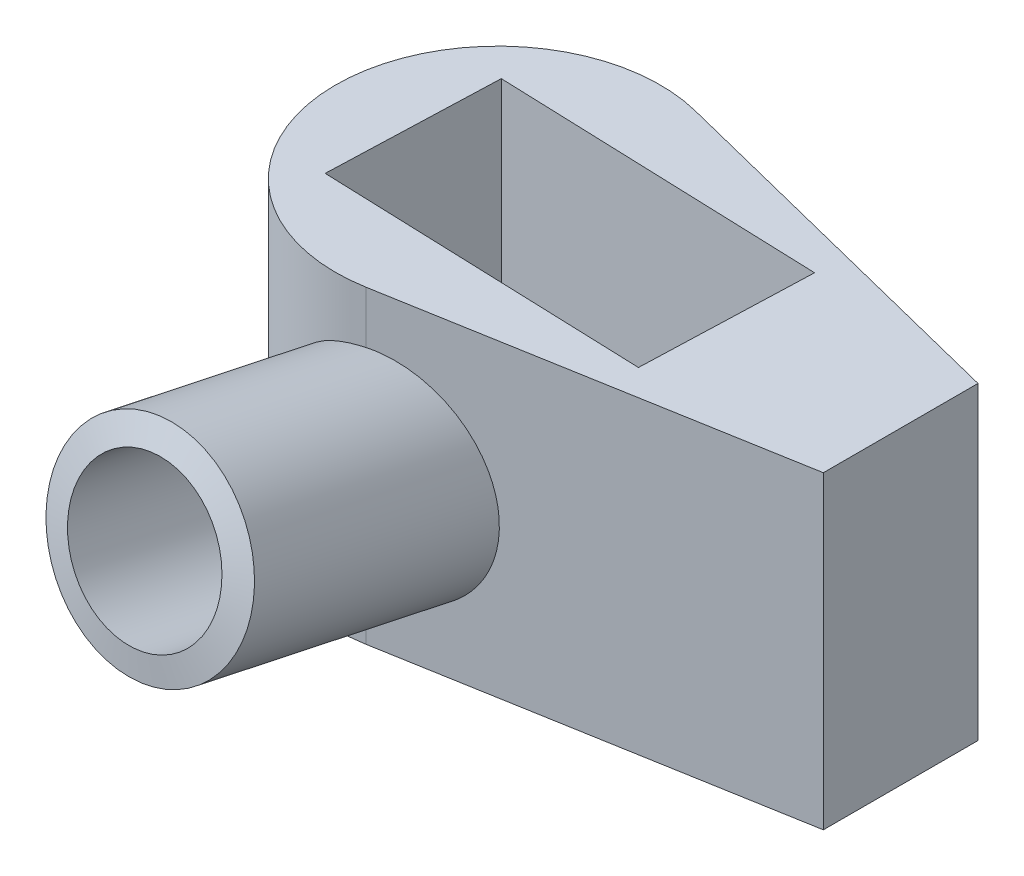
ISO-10303-21;
HEADER;
FILE_DESCRIPTION(('STEP AP214'),'2;1');
FILE_NAME('part.step','',(''),(''),'','','');
FILE_SCHEMA(('AUTOMOTIVE_DESIGN { 1 0 10303 214 1 1 1 1 }'));
ENDSEC;
DATA;
#1=APPLICATION_CONTEXT('core data for automotive mechanical design processes');
#2=APPLICATION_PROTOCOL_DEFINITION('international standard','automotive_design',2000,#1);
#3=PRODUCT_CONTEXT('',#1,'mechanical');
#4=PRODUCT('Part','Part','',(#3));
#5=PRODUCT_RELATED_PRODUCT_CATEGORY('part','',(#4));
#6=PRODUCT_DEFINITION_FORMATION('','',#4);
#7=PRODUCT_DEFINITION_CONTEXT('part definition',#1,'design');
#8=PRODUCT_DEFINITION('design','',#6,#7);
#9=PRODUCT_DEFINITION_SHAPE('','',#8);
#10=(LENGTH_UNIT() NAMED_UNIT(*) SI_UNIT(.MILLI.,.METRE.));
#11=(NAMED_UNIT(*) PLANE_ANGLE_UNIT() SI_UNIT($,.RADIAN.));
#12=(NAMED_UNIT(*) SI_UNIT($,.STERADIAN.) SOLID_ANGLE_UNIT());
#13=UNCERTAINTY_MEASURE_WITH_UNIT(LENGTH_MEASURE(1.E-05),#10,'distance_accuracy_value','');
#14=(GEOMETRIC_REPRESENTATION_CONTEXT(3) GLOBAL_UNCERTAINTY_ASSIGNED_CONTEXT((#13)) GLOBAL_UNIT_ASSIGNED_CONTEXT((#10,
#11,#12)) REPRESENTATION_CONTEXT('',''));
#15=CARTESIAN_POINT('',(0.,0.,0.));
#16=DIRECTION('',(0.,0.,1.));
#17=DIRECTION('',(1.,0.,0.));
#18=AXIS2_PLACEMENT_3D('',#15,#16,#17);
#19=CARTESIAN_POINT('',(53.9751275761126,40.,11.889028669203));
#20=DIRECTION('',(-0.172085400555684,0.,-0.985082034612138));
#21=DIRECTION('',(-0.985082034612138,0.,0.172085400555684));
#22=AXIS2_PLACEMENT_3D('',#19,#20,#21);
#23=PLANE('',#22);
#24=DIRECTION('',(0.,-1.,0.));
#25=VECTOR('',#24,1.);
#26=CARTESIAN_POINT('',(3.61379341166937,40.,20.6867227268549));
#27=LINE('',#26,#25);
#28=CARTESIAN_POINT('',(3.61379341166937,40.,20.6867227268549));
#29=VERTEX_POINT('',#28);
#30=CARTESIAN_POINT('',(3.61379341166937,33.2416263333403,20.6867227268549));
#31=VERTEX_POINT('',#30);
#32=EDGE_CURVE('E120',#29,#31,#27,.T.);
#33=ORIENTED_EDGE('',*,*,#32,.T.);
#34=CARTESIAN_POINT('',(5.1,19.7721701382296,20.4270951556729));
#35=DIRECTION('',(-0.172085400555684,0.,-0.985082034612138));
#36=DIRECTION('',(0.619477545336305,-0.777519491510713,-0.108217425329885));
#37=AXIS2_PLACEMENT_3D('',#34,#35,#36);
#38=ELLIPSE('',#37,13.7044423973439,13.2044300412957);
#39=CARTESIAN_POINT('',(3.61379341166937,6.41319376064316,20.6867227268549));
#40=VERTEX_POINT('',#39);
#41=EDGE_CURVE('E11',#31,#40,#38,.T.);
#42=ORIENTED_EDGE('',*,*,#41,.T.);
#43=CARTESIAN_POINT('',(3.61379341166937,0.,20.6867227268549));
#44=VERTEX_POINT('',#43);
#45=EDGE_CURVE('E121',#40,#44,#27,.T.);
#46=ORIENTED_EDGE('',*,*,#45,.T.);
#47=DIRECTION('',(0.985082034612138,0.,-0.172085400555684));
#48=VECTOR('',#47,1.);
#49=CARTESIAN_POINT('',(53.9751275761126,0.,11.889028669203));
#50=LINE('',#49,#48);
#51=CARTESIAN_POINT('',(53.9751275761126,0.,11.889028669203));
#52=VERTEX_POINT('',#51);
#53=EDGE_CURVE('E205',#44,#52,#50,.T.);
#54=ORIENTED_EDGE('',*,*,#53,.T.);
#55=DIRECTION('',(0.,-1.,0.));
#56=VECTOR('',#55,1.);
#57=CARTESIAN_POINT('',(53.9751275761126,40.,11.889028669203));
#58=LINE('',#57,#56);
#59=CARTESIAN_POINT('',(53.9751275761126,40.,11.889028669203));
#60=VERTEX_POINT('',#59);
#61=EDGE_CURVE('E126',#60,#52,#58,.T.);
#62=ORIENTED_EDGE('',*,*,#61,.F.);
#63=DIRECTION('',(0.985082034612138,0.,-0.172085400555684));
#64=VECTOR('',#63,1.);
#65=CARTESIAN_POINT('',(53.9751275761126,40.,11.889028669203));
#66=LINE('',#65,#64);
#67=EDGE_CURVE('E197',#29,#60,#66,.T.);
#68=ORIENTED_EDGE('',*,*,#67,.F.);
#69=EDGE_LOOP('',(#33,#42,#46,#54,#62,#68));
#70=FACE_BOUND('',#69,.T.);
#71=ADVANCED_FACE('F36',(#70),#23,.F.);
#72=CARTESIAN_POINT('',(0.,40.,0.));
#73=DIRECTION('',(0.,-1.,0.));
#74=DIRECTION('',(0.,0.,-1.));
#75=AXIS2_PLACEMENT_3D('',#72,#73,#74);
#76=CYLINDRICAL_SURFACE('',#75,6.);
#77=CARTESIAN_POINT('',(0.,6.,0.));
#78=DIRECTION('',(0.,-1.,0.));
#79=DIRECTION('',(0.,0.,-1.));
#80=AXIS2_PLACEMENT_3D('',#77,#78,#79);
#81=CIRCLE('',#80,6.);
#82=CARTESIAN_POINT('',(0.,6.,-6.));
#83=VERTEX_POINT('',#82);
#84=EDGE_CURVE('E178',#83,#83,#81,.T.);
#85=ORIENTED_EDGE('',*,*,#84,.T.);
#86=EDGE_LOOP('',(#85));
#87=FACE_BOUND('',#86,.T.);
#88=CARTESIAN_POINT('',(0.,9.5,0.));
#89=DIRECTION('',(0.,1.,0.));
#90=DIRECTION('',(0.,0.,1.));
#91=AXIS2_PLACEMENT_3D('',#88,#89,#90);
#92=CIRCLE('',#91,6.);
#93=CARTESIAN_POINT('',(0.,9.5,6.));
#94=VERTEX_POINT('',#93);
#95=EDGE_CURVE('E134',#94,#94,#92,.F.);
#96=ORIENTED_EDGE('',*,*,#95,.F.);
#97=EDGE_LOOP('',(#96));
#98=FACE_BOUND('',#97,.T.);
#99=ADVANCED_FACE('F251',(#87,#98),#76,.F.);
#100=CARTESIAN_POINT('',(0.,40.,0.));
#101=DIRECTION('',(0.,1.,0.));
#102=DIRECTION('',(0.,0.,1.));
#103=AXIS2_PLACEMENT_3D('',#100,#101,#102);
#104=PLANE('',#103);
#105=CARTESIAN_POINT('',(0.,40.,0.));
#106=DIRECTION('',(0.,1.,0.));
#107=DIRECTION('',(0.,0.,1.));
#108=AXIS2_PLACEMENT_3D('',#105,#106,#107);
#109=CIRCLE('',#108,21.);
#110=CARTESIAN_POINT('',(5.10954501363541,40.,-20.3689113541601));
#111=VERTEX_POINT('',#110);
#112=EDGE_CURVE('E114',#111,#29,#109,.T.);
#113=ORIENTED_EDGE('',*,*,#112,.T.);
#114=ORIENTED_EDGE('',*,*,#67,.T.);
#115=DIRECTION('',(0.,0.,-1.));
#116=VECTOR('',#115,1.);
#117=CARTESIAN_POINT('',(53.9751275761126,40.,-8.11097133079702));
#118=LINE('',#117,#116);
#119=CARTESIAN_POINT('',(53.9751275761126,40.,-8.11097133079702));
#120=VERTEX_POINT('',#119);
#121=EDGE_CURVE('E200',#60,#120,#118,.T.);
#122=ORIENTED_EDGE('',*,*,#121,.T.);
#123=DIRECTION('',(-0.969948159721911,0.,-0.243311667315972));
#124=VECTOR('',#123,1.);
#125=CARTESIAN_POINT('',(53.9751275761126,40.,-8.11097133079702));
#126=LINE('',#125,#124);
#127=EDGE_CURVE('E194',#120,#111,#126,.T.);
#128=ORIENTED_EDGE('',*,*,#127,.T.);
#129=EDGE_LOOP('',(#113,#114,#122,#128));
#130=FACE_BOUND('',#129,.T.);
#131=DIRECTION('',(0.999374020875883,0.,0.0353774843420394));
#132=VECTOR('',#131,1.);
#133=CARTESIAN_POINT('',(0.390162289046507,40.,-11.0216444965026));
#134=LINE('',#133,#132);
#135=CARTESIAN_POINT('',(-10.9888395087413,40.,-11.4244571067168));
#136=VERTEX_POINT('',#135);
#137=CARTESIAN_POINT('',(31.0111604912587,40.,-9.93767206795486));
#138=VERTEX_POINT('',#137);
#139=EDGE_CURVE('E141',#136,#138,#134,.T.);
#140=ORIENTED_EDGE('',*,*,#139,.T.);
#141=DIRECTION('',(-0.0353774843420385,0.,0.999374020875883));
#142=VECTOR('',#141,1.);
#143=CARTESIAN_POINT('',(30.6209982022122,40.,1.08397242854774));
#144=LINE('',#143,#142);
#145=CARTESIAN_POINT('',(30.2323683280976,40.,12.0623279320451));
#146=VERTEX_POINT('',#145);
#147=EDGE_CURVE('E136',#138,#146,#144,.T.);
#148=ORIENTED_EDGE('',*,*,#147,.T.);
#149=DIRECTION('',(0.999374020875883,0.,0.0353774843420387));
#150=VECTOR('',#149,1.);
#151=CARTESIAN_POINT('',(-0.388629874114518,40.,10.9783555034974));
#152=LINE('',#151,#150);
#153=CARTESIAN_POINT('',(-11.7676316719024,40.,10.5755428932832));
#154=VERTEX_POINT('',#153);
#155=EDGE_CURVE('E160',#154,#146,#152,.T.);
#156=ORIENTED_EDGE('',*,*,#155,.F.);
#157=DIRECTION('',(-0.035377484342039,0.,0.999374020875883));
#158=VECTOR('',#157,1.);
#159=CARTESIAN_POINT('',(-11.3790017977878,40.,-0.402812610214199));
#160=LINE('',#159,#158);
#161=EDGE_CURVE('E171',#136,#154,#160,.T.);
#162=ORIENTED_EDGE('',*,*,#161,.F.);
#163=EDGE_LOOP('',(#140,#148,#156,#162));
#164=FACE_BOUND('',#163,.T.);
#165=ADVANCED_FACE('F231',(#130,#164),#104,.T.);
#166=CARTESIAN_POINT('',(0.,40.,0.));
#167=DIRECTION('',(0.,-1.,0.));
#168=DIRECTION('',(0.,0.,-1.));
#169=AXIS2_PLACEMENT_3D('',#166,#167,#168);
#170=CYLINDRICAL_SURFACE('',#169,21.);
#171=DIRECTION('',(0.,-1.,0.));
#172=VECTOR('',#171,1.);
#173=CARTESIAN_POINT('',(5.10954501363541,40.,-20.3689113541601));
#174=LINE('',#173,#172);
#175=CARTESIAN_POINT('',(5.10954501363541,0.,-20.3689113541601));
#176=VERTEX_POINT('',#175);
#177=EDGE_CURVE('E124',#111,#176,#174,.T.);
#178=ORIENTED_EDGE('',*,*,#177,.T.);
#179=CARTESIAN_POINT('',(0.,0.,0.));
#180=DIRECTION('',(0.,1.,0.));
#181=DIRECTION('',(0.,0.,1.));
#182=AXIS2_PLACEMENT_3D('',#179,#180,#181);
#183=CIRCLE('',#182,21.);
#184=EDGE_CURVE('E131',#176,#44,#183,.T.);
#185=ORIENTED_EDGE('',*,*,#184,.T.);
#186=ORIENTED_EDGE('',*,*,#45,.F.);
#187=CARTESIAN_POINT('',(3.61379341166937,6.41319376064314,20.6867227268549));
#188=CARTESIAN_POINT('',(3.4406866268785,6.43967473525934,20.7169651869853));
#189=CARTESIAN_POINT('',(3.26767481755828,6.46921375082632,20.744946875958));
#190=CARTESIAN_POINT('',(2.92214803679435,6.53443954482262,20.7964312070106));
#191=CARTESIAN_POINT('',(2.74963305576395,6.5701262038093,20.8199339360936));
#192=CARTESIAN_POINT('',(2.2334201247426,6.68642612233554,20.883772167138));
#193=CARTESIAN_POINT('',(1.89091637353372,6.77630028253757,20.9174616356641));
#194=CARTESIAN_POINT('',(1.21311325218182,6.98031963567896,20.9676789362583));
#195=CARTESIAN_POINT('',(0.877795356928229,7.09439123314492,20.9842579319212));
#196=CARTESIAN_POINT('',(0.215926054239946,7.34664031005005,21.0014988611094));
#197=CARTESIAN_POINT('',(-0.110625354159825,7.48481778683544,21.002160796387));
#198=CARTESIAN_POINT('',(-0.752409842520663,7.78472246853731,20.9889712465718));
#199=CARTESIAN_POINT('',(-1.06764294858037,7.94644961914673,20.9751197949475));
#200=CARTESIAN_POINT('',(-1.68445749480928,8.29273088328641,20.9346158658426));
#201=CARTESIAN_POINT('',(-1.98603841597476,8.4772858636494,20.907962902144));
#202=CARTESIAN_POINT('',(-2.57351175149844,8.86843336965131,20.8438095428189));
#203=CARTESIAN_POINT('',(-2.85939749569592,9.07503515664641,20.8063045771035));
#204=CARTESIAN_POINT('',(-3.4133952034722,9.50923849525981,20.7226259623945));
#205=CARTESIAN_POINT('',(-3.68150689521243,9.73684036792875,20.6764521808603));
#206=CARTESIAN_POINT('',(-4.20468306377722,10.2179548456241,20.5765240996396));
#207=CARTESIAN_POINT('',(-4.45925016806602,10.4719749505547,20.5226084255693));
#208=CARTESIAN_POINT('',(-4.94610864890037,10.9997160433946,20.4107425919776));
#209=CARTESIAN_POINT('',(-5.17839962439815,11.2734373858394,20.3527923598525));
#210=CARTESIAN_POINT('',(-5.61915054806702,11.8392421374235,20.2355422977644));
#211=CARTESIAN_POINT('',(-5.82760694671453,12.1313282714954,20.1762422683579));
#212=CARTESIAN_POINT('',(-6.21920175415246,12.7322729652409,20.0589960200726));
#213=CARTESIAN_POINT('',(-6.40234010538423,13.0411315630433,20.0010498042719));
#214=CARTESIAN_POINT('',(-6.74523850113752,13.6798747963137,19.8880613570167));
#215=CARTESIAN_POINT('',(-6.90448767295415,14.0100476035405,19.833095316117));
#216=CARTESIAN_POINT('',(-7.1941852340663,14.6838199960723,19.7298598600606));
#217=CARTESIAN_POINT('',(-7.32463335699217,15.0274197055229,19.6815905068404));
#218=CARTESIAN_POINT('',(-7.5557670921894,15.7254102196852,19.5940212955702));
#219=CARTESIAN_POINT('',(-7.65646783716313,16.0797954361739,19.5547168793201));
#220=CARTESIAN_POINT('',(-7.82762217515578,16.7967940071999,19.4868373484372));
#221=CARTESIAN_POINT('',(-7.89807713392529,17.1594069894331,19.4582617493513));
#222=CARTESIAN_POINT('',(-8.00607893051959,17.8735710220307,19.4140655281427));
#223=CARTESIAN_POINT('',(-8.04495974498547,18.2248889821966,19.3979214459883));
#224=CARTESIAN_POINT('',(-8.09512978233343,18.9298092773181,19.3770383871758));
#225=CARTESIAN_POINT('',(-8.10641981934659,19.2834115445611,19.3722990739931));
#226=CARTESIAN_POINT('',(-8.10186658020297,19.9904507511314,19.3742033744559));
#227=CARTESIAN_POINT('',(-8.08601882641705,20.3438876535494,19.3808488665497));
#228=CARTESIAN_POINT('',(-8.02786519226363,21.0481930828563,19.4050086312341));
#229=CARTESIAN_POINT('',(-7.98555846818703,21.3990615274826,19.4225232504133));
#230=CARTESIAN_POINT('',(-7.87450602255103,22.1011577628491,19.4678143005907));
#231=CARTESIAN_POINT('',(-7.80538438497793,22.4523164300174,19.4957364046482));
#232=CARTESIAN_POINT('',(-7.64166828309787,23.1477854880021,19.5604867085804));
#233=CARTESIAN_POINT('',(-7.54707369431848,23.4920958453459,19.5973149519746));
#234=CARTESIAN_POINT('',(-7.33323092754555,24.1723240687198,19.678333156654));
#235=CARTESIAN_POINT('',(-7.21396648230207,24.5082362323469,19.7225279716879));
#236=CARTESIAN_POINT('',(-6.95162966460662,25.1698396214289,19.8165145787236));
#237=CARTESIAN_POINT('',(-6.80855510032763,25.4955299026304,19.8663068858624));
#238=CARTESIAN_POINT('',(-6.48200403396814,26.170941007667,19.9753970412892));
#239=CARTESIAN_POINT('',(-6.29579842440257,26.5192746943074,20.0351351471585));
#240=CARTESIAN_POINT('',(-5.89565005917996,27.199336654325,20.1565130384031));
#241=CARTESIAN_POINT('',(-5.68170396860758,27.5310629245287,20.2181530517426));
#242=CARTESIAN_POINT('',(-5.22690849347161,28.1755464213939,20.3404733328759));
#243=CARTESIAN_POINT('',(-4.98606948864546,28.4883108952311,20.4011539607067));
#244=CARTESIAN_POINT('',(-4.47817636195125,29.0925408747656,20.5186218267269));
#245=CARTESIAN_POINT('',(-4.211127164658,29.3840103636465,20.5754097929072));
#246=CARTESIAN_POINT('',(-3.69649636053821,29.8981830434277,20.6734880030168));
#247=CARTESIAN_POINT('',(-3.45264084937392,30.1244255695042,20.7158039299815));
#248=CARTESIAN_POINT('',(-2.94788843912491,30.5580715854322,20.7936314416027));
#249=CARTESIAN_POINT('',(-2.68700133469381,30.7654857419956,20.8291468917011));
#250=CARTESIAN_POINT('',(-2.14900046249653,31.1596971243057,20.8915085036125));
#251=CARTESIAN_POINT('',(-1.87188397315247,31.3464908768858,20.9183532064434));
#252=CARTESIAN_POINT('',(-1.3028213553076,31.6973824239541,20.9614897502994));
#253=CARTESIAN_POINT('',(-1.01087579292371,31.8614810839645,20.9777819938507));
#254=CARTESIAN_POINT('',(-0.411228635865967,32.1663593337912,20.9981352201875));
#255=CARTESIAN_POINT('',(-0.103407450950683,32.3069121565591,21.0020830853297));
#256=CARTESIAN_POINT('',(0.523174138729194,32.5609801940714,20.9958191946069));
#257=CARTESIAN_POINT('',(0.841936612671032,32.6744902619957,20.9856047458667));
#258=CARTESIAN_POINT('',(1.48653610899503,32.8726357551541,20.9498005277432));
#259=CARTESIAN_POINT('',(1.81235189161871,32.9573477185461,20.9242520208742));
#260=CARTESIAN_POINT('',(2.4684222646589,33.097295697814,20.857023365402));
#261=CARTESIAN_POINT('',(2.79867270478996,33.1525575390727,20.8153574060344));
#262=CARTESIAN_POINT('',(3.21007921779283,33.2028578095296,20.7533634644309));
#263=CARTESIAN_POINT('',(3.29085899858359,33.2118464486615,20.7407078470398));
#264=CARTESIAN_POINT('',(3.45235878305121,33.228055591135,20.7144367551239));
#265=CARTESIAN_POINT('',(3.53307876880935,33.2352777992461,20.7008222225195));
#266=CARTESIAN_POINT('',(3.61379341166937,33.2416263333403,20.6867227268549));
#267=B_SPLINE_CURVE_WITH_KNOTS('',3,(#187,#188,#189,#190,#191,#192,#193,#194,#195,#196,#197,
#198,#199,#200,#201,#202,#203,#204,#205,#206,#207,#208,#209,#210,#211,#212,#213,#214,#215,#216,
#217,#218,#219,#220,#221,#222,#223,#224,#225,#226,#227,#228,#229,#230,#231,#232,#233,#234,#235,
#236,#237,#238,#239,#240,#241,#242,#243,#244,#245,#246,#247,#248,#249,#250,#251,#252,#253,#254,
#255,#256,#257,#258,#259,#260,#261,#262,#263,#264,#265,#266),.UNSPECIFIED.,.F.,.F.,(4,2,2,2,2,2,
2,2,2,2,2,2,2,2,2,2,2,2,2,2,2,2,2,2,2,2,2,2,2,2,2,2,2,2,2,2,2,2,2,4),(0.,0.533053922389014,
1.0660974892353,2.13176173171637,3.19423011938456,4.25669839008791,5.31916421071057,
6.38167038834821,7.44462467062562,8.50759520610896,9.59728536304851,10.6869951345184,
11.7768669783617,12.8667412999046,13.9773437778471,15.0879565268883,16.1980033225429,
17.3079999886829,18.3682229414813,19.4284146095187,20.4887812218829,21.5491816483591,
22.6250186850558,23.7008609788769,24.7774149552527,25.854068088069,27.0511543630877,
28.2483846835274,29.4451545012279,30.6416998894025,31.6467173343914,32.6511618130214,
33.6557752164297,34.6603502963483,35.6741042156193,36.6880509202898,37.6992813458038,
38.7096235384744,38.9563828182384,39.202903004351),.UNSPECIFIED.);
#268=EDGE_CURVE('E51',#40,#31,#267,.T.);
#269=ORIENTED_EDGE('',*,*,#268,.T.);
#270=ORIENTED_EDGE('',*,*,#32,.F.);
#271=ORIENTED_EDGE('',*,*,#112,.F.);
#272=EDGE_LOOP('',(#178,#185,#186,#269,#270,#271));
#273=FACE_BOUND('',#272,.T.);
#274=ADVANCED_FACE('F227',(#273),#170,.T.);
#275=CARTESIAN_POINT('',(0.,0.,0.));
#276=DIRECTION('',(0.,1.,0.));
#277=DIRECTION('',(0.,0.,1.));
#278=AXIS2_PLACEMENT_3D('',#275,#276,#277);
#279=PLANE('',#278);
#280=CARTESIAN_POINT('',(0.,0.,0.));
#281=DIRECTION('',(0.,-1.,0.));
#282=DIRECTION('',(0.,0.,-1.));
#283=AXIS2_PLACEMENT_3D('',#280,#281,#282);
#284=CIRCLE('',#283,8.22726922087799);
#285=CARTESIAN_POINT('',(0.,0.,-8.22726922087799));
#286=VERTEX_POINT('',#285);
#287=EDGE_CURVE('E187',#286,#286,#284,.T.);
#288=ORIENTED_EDGE('',*,*,#287,.F.);
#289=EDGE_LOOP('',(#288));
#290=FACE_BOUND('',#289,.T.);
#291=ORIENTED_EDGE('',*,*,#184,.F.);
#292=DIRECTION('',(-0.969948159721911,0.,-0.243311667315972));
#293=VECTOR('',#292,1.);
#294=CARTESIAN_POINT('',(53.9751275761126,0.,-8.11097133079702));
#295=LINE('',#294,#293);
#296=CARTESIAN_POINT('',(53.9751275761126,0.,-8.11097133079702));
#297=VERTEX_POINT('',#296);
#298=EDGE_CURVE('E191',#297,#176,#295,.T.);
#299=ORIENTED_EDGE('',*,*,#298,.F.);
#300=DIRECTION('',(0.,0.,-1.));
#301=VECTOR('',#300,1.);
#302=CARTESIAN_POINT('',(53.9751275761126,0.,-8.11097133079702));
#303=LINE('',#302,#301);
#304=EDGE_CURVE('E198',#52,#297,#303,.T.);
#305=ORIENTED_EDGE('',*,*,#304,.F.);
#306=ORIENTED_EDGE('',*,*,#53,.F.);
#307=EDGE_LOOP('',(#291,#299,#305,#306));
#308=FACE_BOUND('',#307,.T.);
#309=ADVANCED_FACE('F223',(#290,#308),#279,.F.);
#310=CARTESIAN_POINT('',(53.9751275761126,40.,-8.11097133079702));
#311=DIRECTION('',(-0.243311667315972,0.,0.969948159721911));
#312=DIRECTION('',(0.969948159721911,0.,0.243311667315972));
#313=AXIS2_PLACEMENT_3D('',#310,#311,#312);
#314=PLANE('',#313);
#315=ORIENTED_EDGE('',*,*,#298,.T.);
#316=ORIENTED_EDGE('',*,*,#177,.F.);
#317=ORIENTED_EDGE('',*,*,#127,.F.);
#318=DIRECTION('',(0.,-1.,0.));
#319=VECTOR('',#318,1.);
#320=CARTESIAN_POINT('',(53.9751275761126,40.,-8.11097133079702));
#321=LINE('',#320,#319);
#322=EDGE_CURVE('E202',#120,#297,#321,.T.);
#323=ORIENTED_EDGE('',*,*,#322,.T.);
#324=EDGE_LOOP('',(#315,#316,#317,#323));
#325=FACE_BOUND('',#324,.T.);
#326=ADVANCED_FACE('F225',(#325),#314,.F.);
#327=CARTESIAN_POINT('',(53.9751275761126,40.,-8.11097133079702));
#328=DIRECTION('',(-1.,0.,0.));
#329=DIRECTION('',(0.,0.,1.));
#330=AXIS2_PLACEMENT_3D('',#327,#328,#329);
#331=PLANE('',#330);
#332=ORIENTED_EDGE('',*,*,#304,.T.);
#333=ORIENTED_EDGE('',*,*,#322,.F.);
#334=ORIENTED_EDGE('',*,*,#121,.F.);
#335=ORIENTED_EDGE('',*,*,#61,.T.);
#336=EDGE_LOOP('',(#332,#333,#334,#335));
#337=FACE_BOUND('',#336,.T.);
#338=ADVANCED_FACE('F217',(#337),#331,.F.);
#339=CARTESIAN_POINT('',(0.,6.,0.));
#340=DIRECTION('',(0.,-1.,0.));
#341=DIRECTION('',(0.,0.,-1.));
#342=AXIS2_PLACEMENT_3D('',#339,#340,#341);
#343=CYLINDRICAL_SURFACE('',#342,8.22726922087799);
#344=CARTESIAN_POINT('',(0.,6.,0.));
#345=DIRECTION('',(0.,-1.,0.));
#346=DIRECTION('',(0.,0.,-1.));
#347=AXIS2_PLACEMENT_3D('',#344,#345,#346);
#348=CIRCLE('',#347,8.22726922087799);
#349=CARTESIAN_POINT('',(0.,6.,-8.22726922087799));
#350=VERTEX_POINT('',#349);
#351=EDGE_CURVE('E188',#350,#350,#348,.T.);
#352=ORIENTED_EDGE('',*,*,#351,.F.);
#353=EDGE_LOOP('',(#352));
#354=FACE_BOUND('',#353,.T.);
#355=ORIENTED_EDGE('',*,*,#287,.T.);
#356=EDGE_LOOP('',(#355));
#357=FACE_BOUND('',#356,.T.);
#358=ADVANCED_FACE('F377',(#354,#357),#343,.F.);
#359=CARTESIAN_POINT('',(0.,6.,0.));
#360=DIRECTION('',(0.,-1.,0.));
#361=DIRECTION('',(0.,0.,-1.));
#362=AXIS2_PLACEMENT_3D('',#359,#360,#361);
#363=PLANE('',#362);
#364=ORIENTED_EDGE('',*,*,#84,.F.);
#365=EDGE_LOOP('',(#364));
#366=FACE_BOUND('',#365,.T.);
#367=ORIENTED_EDGE('',*,*,#351,.T.);
#368=EDGE_LOOP('',(#367));
#369=FACE_BOUND('',#368,.T.);
#370=ADVANCED_FACE('F366',(#366,#369),#363,.T.);
#371=CARTESIAN_POINT('',(30.6209982022122,15.,1.08397242854774));
#372=DIRECTION('',(-0.999374020875883,0.,-0.0353774843420385));
#373=DIRECTION('',(-0.0353774843420385,0.,0.999374020875883));
#374=AXIS2_PLACEMENT_3D('',#371,#372,#373);
#375=PLANE('',#374);
#376=ORIENTED_EDGE('',*,*,#147,.F.);
#377=DIRECTION('',(0.,1.,0.));
#378=VECTOR('',#377,1.);
#379=CARTESIAN_POINT('',(31.0111604912587,15.,-9.93767206795486));
#380=LINE('',#379,#378);
#381=CARTESIAN_POINT('',(31.0111604912587,15.,-9.93767206795486));
#382=VERTEX_POINT('',#381);
#383=EDGE_CURVE('E167',#382,#138,#380,.T.);
#384=ORIENTED_EDGE('',*,*,#383,.F.);
#385=DIRECTION('',(-0.0353774843420385,0.,0.999374020875883));
#386=VECTOR('',#385,1.);
#387=CARTESIAN_POINT('',(30.6209982022122,15.,1.08397242854774));
#388=LINE('',#387,#386);
#389=CARTESIAN_POINT('',(30.2323683280976,15.,12.0623279320451));
#390=VERTEX_POINT('',#389);
#391=EDGE_CURVE('E157',#382,#390,#388,.T.);
#392=ORIENTED_EDGE('',*,*,#391,.T.);
#393=DIRECTION('',(0.,1.,0.));
#394=VECTOR('',#393,1.);
#395=CARTESIAN_POINT('',(30.2323683280976,15.,12.0623279320451));
#396=LINE('',#395,#394);
#397=EDGE_CURVE('E176',#390,#146,#396,.T.);
#398=ORIENTED_EDGE('',*,*,#397,.T.);
#399=EDGE_LOOP('',(#376,#384,#392,#398));
#400=FACE_BOUND('',#399,.T.);
#401=ADVANCED_FACE('F356',(#400),#375,.T.);
#402=CARTESIAN_POINT('',(-0.388629874114518,15.,10.9783555034974));
#403=DIRECTION('',(-0.0353774843420387,0.,0.999374020875883));
#404=DIRECTION('',(0.999374020875883,0.,0.0353774843420387));
#405=AXIS2_PLACEMENT_3D('',#402,#403,#404);
#406=PLANE('',#405);
#407=ORIENTED_EDGE('',*,*,#155,.T.);
#408=ORIENTED_EDGE('',*,*,#397,.F.);
#409=DIRECTION('',(0.999374020875883,0.,0.0353774843420387));
#410=VECTOR('',#409,1.);
#411=CARTESIAN_POINT('',(-0.388629874114518,15.,10.9783555034974));
#412=LINE('',#411,#410);
#413=CARTESIAN_POINT('',(-11.7676316719024,15.,10.5755428932832));
#414=VERTEX_POINT('',#413);
#415=EDGE_CURVE('E165',#414,#390,#412,.T.);
#416=ORIENTED_EDGE('',*,*,#415,.F.);
#417=DIRECTION('',(0.,1.,0.));
#418=VECTOR('',#417,1.);
#419=CARTESIAN_POINT('',(-11.7676316719024,15.,10.5755428932832));
#420=LINE('',#419,#418);
#421=EDGE_CURVE('E179',#414,#154,#420,.T.);
#422=ORIENTED_EDGE('',*,*,#421,.T.);
#423=EDGE_LOOP('',(#407,#408,#416,#422));
#424=FACE_BOUND('',#423,.T.);
#425=ADVANCED_FACE('F346',(#424),#406,.F.);
#426=CARTESIAN_POINT('',(-11.3790017977878,15.,-0.402812610214199));
#427=DIRECTION('',(-0.999374020875882,0.,-0.035377484342039));
#428=DIRECTION('',(-0.035377484342039,0.,0.999374020875883));
#429=AXIS2_PLACEMENT_3D('',#426,#427,#428);
#430=PLANE('',#429);
#431=ORIENTED_EDGE('',*,*,#161,.T.);
#432=ORIENTED_EDGE('',*,*,#421,.F.);
#433=DIRECTION('',(-0.035377484342039,0.,0.999374020875883));
#434=VECTOR('',#433,1.);
#435=CARTESIAN_POINT('',(-11.3790017977878,15.,-0.402812610214199));
#436=LINE('',#435,#434);
#437=CARTESIAN_POINT('',(-10.9888395087413,15.,-11.4244571067168));
#438=VERTEX_POINT('',#437);
#439=EDGE_CURVE('E162',#438,#414,#436,.T.);
#440=ORIENTED_EDGE('',*,*,#439,.F.);
#441=DIRECTION('',(0.,1.,0.));
#442=VECTOR('',#441,1.);
#443=CARTESIAN_POINT('',(-10.9888395087413,15.,-11.4244571067168));
#444=LINE('',#443,#442);
#445=EDGE_CURVE('E181',#438,#136,#444,.T.);
#446=ORIENTED_EDGE('',*,*,#445,.T.);
#447=EDGE_LOOP('',(#431,#432,#440,#446));
#448=FACE_BOUND('',#447,.T.);
#449=ADVANCED_FACE('F336',(#448),#430,.F.);
#450=CARTESIAN_POINT('',(0.390162289046507,15.,-11.0216444965026));
#451=DIRECTION('',(-0.0353774843420394,0.,0.999374020875882));
#452=DIRECTION('',(0.999374020875883,0.,0.0353774843420394));
#453=AXIS2_PLACEMENT_3D('',#450,#451,#452);
#454=PLANE('',#453);
#455=ORIENTED_EDGE('',*,*,#139,.F.);
#456=ORIENTED_EDGE('',*,*,#445,.F.);
#457=DIRECTION('',(0.999374020875883,0.,0.0353774843420394));
#458=VECTOR('',#457,1.);
#459=CARTESIAN_POINT('',(0.390162289046507,15.,-11.0216444965026));
#460=LINE('',#459,#458);
#461=EDGE_CURVE('E159',#438,#382,#460,.T.);
#462=ORIENTED_EDGE('',*,*,#461,.T.);
#463=ORIENTED_EDGE('',*,*,#383,.T.);
#464=EDGE_LOOP('',(#455,#456,#462,#463));
#465=FACE_BOUND('',#464,.T.);
#466=ADVANCED_FACE('F319',(#465),#454,.T.);
#467=CARTESIAN_POINT('',(0.,15.,0.));
#468=DIRECTION('',(0.,1.,0.));
#469=DIRECTION('',(0.,0.,1.));
#470=AXIS2_PLACEMENT_3D('',#467,#468,#469);
#471=PLANE('',#470);
#472=CARTESIAN_POINT('',(0.,15.,0.));
#473=DIRECTION('',(0.,1.,0.));
#474=DIRECTION('',(0.,0.,1.));
#475=AXIS2_PLACEMENT_3D('',#472,#473,#474);
#476=CIRCLE('',#475,9.55);
#477=CARTESIAN_POINT('',(0.,15.,9.55));
#478=VERTEX_POINT('',#477);
#479=EDGE_CURVE('E144',#478,#478,#476,.T.);
#480=ORIENTED_EDGE('',*,*,#479,.F.);
#481=EDGE_LOOP('',(#480));
#482=FACE_BOUND('',#481,.T.);
#483=ORIENTED_EDGE('',*,*,#391,.F.);
#484=ORIENTED_EDGE('',*,*,#461,.F.);
#485=ORIENTED_EDGE('',*,*,#439,.T.);
#486=ORIENTED_EDGE('',*,*,#415,.T.);
#487=EDGE_LOOP('',(#483,#484,#485,#486));
#488=FACE_BOUND('',#487,.T.);
#489=ADVANCED_FACE('F310',(#482,#488),#471,.T.);
#490=CARTESIAN_POINT('',(0.,9.5,0.));
#491=DIRECTION('',(0.,1.,0.));
#492=DIRECTION('',(0.,0.,1.));
#493=AXIS2_PLACEMENT_3D('',#490,#491,#492);
#494=PLANE('',#493);
#495=CARTESIAN_POINT('',(0.,9.5,0.));
#496=DIRECTION('',(0.,1.,0.));
#497=DIRECTION('',(0.,0.,1.));
#498=AXIS2_PLACEMENT_3D('',#495,#496,#497);
#499=CIRCLE('',#498,9.55);
#500=CARTESIAN_POINT('',(0.,9.5,9.55));
#501=VERTEX_POINT('',#500);
#502=EDGE_CURVE('E137',#501,#501,#499,.T.);
#503=ORIENTED_EDGE('',*,*,#502,.T.);
#504=EDGE_LOOP('',(#503));
#505=FACE_BOUND('',#504,.T.);
#506=ORIENTED_EDGE('',*,*,#95,.T.);
#507=EDGE_LOOP('',(#506));
#508=FACE_BOUND('',#507,.T.);
#509=ADVANCED_FACE('F244',(#505,#508),#494,.T.);
#510=CARTESIAN_POINT('',(0.,9.5,0.));
#511=DIRECTION('',(0.,1.,0.));
#512=DIRECTION('',(0.,0.,1.));
#513=AXIS2_PLACEMENT_3D('',#510,#511,#512);
#514=CYLINDRICAL_SURFACE('',#513,9.55);
#515=ORIENTED_EDGE('',*,*,#502,.F.);
#516=EDGE_LOOP('',(#515));
#517=FACE_BOUND('',#516,.T.);
#518=ORIENTED_EDGE('',*,*,#479,.T.);
#519=EDGE_LOOP('',(#518));
#520=FACE_BOUND('',#519,.T.);
#521=ADVANCED_FACE('F235',(#517,#520),#514,.F.);
#522=CARTESIAN_POINT('',(5.1,20.6635241115686,24.6164588303663));
#523=DIRECTION('',(0.,-0.20810764446486,-0.978105928984835));
#524=DIRECTION('',(0.,0.978105928984835,-0.20810764446486));
#525=AXIS2_PLACEMENT_3D('',#522,#523,#524);
#526=CYLINDRICAL_SURFACE('',#525,13.2044300412957);
#527=CARTESIAN_POINT('',(5.1,26.078855423825,50.0685159979711));
#528=DIRECTION('',(0.,-0.20810764446486,-0.978105928984835));
#529=DIRECTION('',(0.,0.978105928984835,-0.20810764446486));
#530=AXIS2_PLACEMENT_3D('',#527,#528,#529);
#531=CIRCLE('',#530,13.2044300412957);
#532=CARTESIAN_POINT('',(5.1,38.9941867360818,47.320573165576));
#533=VERTEX_POINT('',#532);
#534=EDGE_CURVE('E279',#533,#533,#531,.T.);
#535=ORIENTED_EDGE('',*,*,#534,.T.);
#536=EDGE_LOOP('',(#535));
#537=FACE_BOUND('',#536,.T.);
#538=ORIENTED_EDGE('',*,*,#268,.F.);
#539=ORIENTED_EDGE('',*,*,#41,.F.);
#540=EDGE_LOOP('',(#538,#539));
#541=FACE_BOUND('',#540,.T.);
#542=ADVANCED_FACE('F233',(#537,#541),#526,.T.);
#543=CARTESIAN_POINT('',(5.1,20.6635241115686,24.6164588303663));
#544=DIRECTION('',(0.,-0.20810764446486,-0.978105928984835));
#545=DIRECTION('',(0.,0.978105928984835,-0.20810764446486));
#546=AXIS2_PLACEMENT_3D('',#543,#544,#545);
#547=CYLINDRICAL_SURFACE('',#546,9.78105928984873);
#548=CARTESIAN_POINT('',(5.1,26.2304361947215,50.7809456211846));
#549=DIRECTION('',(0.,-0.20810764446486,-0.978105928984835));
#550=DIRECTION('',(0.,0.978105928984835,-0.20810764446486));
#551=AXIS2_PLACEMENT_3D('',#548,#549,#550);
#552=CIRCLE('',#551,9.78105928984875);
#553=CARTESIAN_POINT('',(5.1,35.7973482778748,48.745432412003));
#554=VERTEX_POINT('',#553);
#555=EDGE_CURVE('E117',#554,#554,#552,.T.);
#556=ORIENTED_EDGE('',*,*,#555,.F.);
#557=EDGE_LOOP('',(#556));
#558=FACE_BOUND('',#557,.T.);
#559=CARTESIAN_POINT('',(3.61379341166937,29.7112958505073,20.6867227268549));
#560=CARTESIAN_POINT('',(3.49718124885451,29.6973031119942,20.7070952008752));
#561=CARTESIAN_POINT('',(3.38069240314177,29.6808975539035,20.7264270218935));
#562=CARTESIAN_POINT('',(3.14817162527371,29.6432627089311,20.7630166294595));
#563=CARTESIAN_POINT('',(3.03213968406344,29.6220335181389,20.7802744573119));
#564=CARTESIAN_POINT('',(2.68517150724852,29.5511397306232,20.828930242893));
#565=CARTESIAN_POINT('',(2.45522753534952,29.494252724414,20.8572340513815));
#566=CARTESIAN_POINT('',(2.00118312542882,29.3619513630123,20.9056729953927));
#567=CARTESIAN_POINT('',(1.77705886065184,29.2866330073873,20.9258490675256));
#568=CARTESIAN_POINT('',(1.33512246072749,29.1179763830504,20.958686592248));
#569=CARTESIAN_POINT('',(1.11731052978427,29.0246375321219,20.9713478019891));
#570=CARTESIAN_POINT('',(0.689811269069009,28.8209520873948,20.9897569359797));
#571=CARTESIAN_POINT('',(0.480114950936962,28.7106250249099,20.9955127333889));
#572=CARTESIAN_POINT('',(0.0698326089101646,28.4738889865382,21.0008866086674));
#573=CARTESIAN_POINT('',(-0.130749831451106,28.3474737578594,21.0005022928621));
#574=CARTESIAN_POINT('',(-0.521713144921831,28.0796617832732,20.9944294499856));
#575=CARTESIAN_POINT('',(-0.712088184265886,27.9382566048409,20.988737923183));
#576=CARTESIAN_POINT('',(-1.08167235765967,27.6416465235601,20.9729401072699));
#577=CARTESIAN_POINT('',(-1.26087702530072,27.4864361602269,20.9628320650166));
#578=CARTESIAN_POINT('',(-1.61661160360753,27.1547496474273,20.9384823141706));
#579=CARTESIAN_POINT('',(-1.79248040443327,26.9775789562682,20.9240476782092));
#580=CARTESIAN_POINT('',(-2.13026901237522,26.6105234198414,20.8923610272842));
#581=CARTESIAN_POINT('',(-2.29218285925379,26.4206332029268,20.8751078175121));
#582=CARTESIAN_POINT('',(-2.60141899412189,26.0294488496893,20.8388306311903));
#583=CARTESIAN_POINT('',(-2.7487392743653,25.8281531502006,20.819806411686));
#584=CARTESIAN_POINT('',(-3.02826340394021,25.4153913137952,20.7809897352265));
#585=CARTESIAN_POINT('',(-3.16046612136548,25.2039244170062,20.7611972208947));
#586=CARTESIAN_POINT('',(-3.42511483552245,24.7445192852738,20.7192847291767));
#587=CARTESIAN_POINT('',(-3.55545451769868,24.4953624842429,20.6971887955701));
#588=CARTESIAN_POINT('',(-3.79566519735223,23.9873419072932,20.6544863692417));
#589=CARTESIAN_POINT('',(-3.90554174579044,23.7284807867862,20.6338794735249));
#590=CARTESIAN_POINT('',(-4.10432205371151,23.2024537731265,20.5952617002695));
#591=CARTESIAN_POINT('',(-4.19321309473464,22.9352829542343,20.5772523995862));
#592=CARTESIAN_POINT('',(-4.34930030110533,22.3945707820353,20.5448276169194));
#593=CARTESIAN_POINT('',(-4.41650454558003,22.1210318418982,20.5304107970622));
#594=CARTESIAN_POINT('',(-4.53118630624381,21.5569266464082,20.5054130203401));
#595=CARTESIAN_POINT('',(-4.577651459964,21.2661447622326,20.4950315953914));
#596=CARTESIAN_POINT('',(-4.64573521875584,20.6815264136717,20.47970620948));
#597=CARTESIAN_POINT('',(-4.66735292908444,20.387689839673,20.4747624443247));
#598=CARTESIAN_POINT('',(-4.6852659889624,19.7992795786327,20.4706709930143));
#599=CARTESIAN_POINT('',(-4.68156858548181,19.5047061266742,20.4715216480871));
#600=CARTESIAN_POINT('',(-4.64857410748433,18.9170738537211,20.4790392435087));
#601=CARTESIAN_POINT('',(-4.61927832259725,18.6240149571725,20.4857058908515));
#602=CARTESIAN_POINT('',(-4.53675661961217,18.0537389189992,20.5041346615122));
#603=CARTESIAN_POINT('',(-4.48456174936736,17.7763651047829,20.5156765209414));
#604=CARTESIAN_POINT('',(-4.35674722916443,17.2272937926584,20.5431989574586));
#605=CARTESIAN_POINT('',(-4.28112811631104,16.9555961647509,20.5591794327708));
#606=CARTESIAN_POINT('',(-4.10687309368918,16.4199290786563,20.5946956666807));
#607=CARTESIAN_POINT('',(-4.0082374323747,16.1559595370825,20.6142313869005));
#608=CARTESIAN_POINT('',(-3.7885890391986,15.6377006986465,20.6557273843193));
#609=CARTESIAN_POINT('',(-3.66757651899505,15.3834113102494,20.6776876385844));
#610=CARTESIAN_POINT('',(-3.40759708002243,14.8930562507015,20.7220941522669));
#611=CARTESIAN_POINT('',(-3.26920290246409,14.6566839612423,20.7445112972909));
#612=CARTESIAN_POINT('',(-2.97302486923025,14.1963906461264,20.7890244593508));
#613=CARTESIAN_POINT('',(-2.81524136961115,13.9724693919343,20.8111204822753));
#614=CARTESIAN_POINT('',(-2.48142808677905,13.5384986958278,20.8535563157405));
#615=CARTESIAN_POINT('',(-2.30539863924928,13.3284489988252,20.8738961585782));
#616=CARTESIAN_POINT('',(-1.93638554632334,12.9235016634651,20.9113556286793));
#617=CARTESIAN_POINT('',(-1.74340188464512,12.7286040396594,20.9284752528499));
#618=CARTESIAN_POINT('',(-1.34013554959353,12.3534560273439,20.9581789450938));
#619=CARTESIAN_POINT('',(-1.12971449533241,12.1733510529856,20.9707213933062));
#620=CARTESIAN_POINT('',(-0.694691588735662,11.8307826878061,20.9896354026018));
#621=CARTESIAN_POINT('',(-0.470089069431066,11.6683201277047,20.9960066732174));
#622=CARTESIAN_POINT('',(-0.00854215344759144,11.3620030297843,21.0012660020124));
#623=CARTESIAN_POINT('',(0.228398861726823,11.2181434308696,21.0001560998931));
#624=CARTESIAN_POINT('',(0.712768653882351,10.9497610039418,20.9892973821513));
#625=CARTESIAN_POINT('',(0.960195557050741,10.8252347394831,20.9795501038688));
#626=CARTESIAN_POINT('',(1.40460612528767,10.6229299292535,20.9538634617213));
#627=CARTESIAN_POINT('',(1.59984408286809,10.5410312099684,20.9399069846671));
#628=CARTESIAN_POINT('',(1.99435957710313,10.3891197260837,20.9060211332796));
#629=CARTESIAN_POINT('',(2.19363647407915,10.3191050955215,20.8860926979859));
#630=CARTESIAN_POINT('',(2.59519744114624,10.1911277776384,20.8400030909623));
#631=CARTESIAN_POINT('',(2.79747992187682,10.1331589475957,20.8138451106492));
#632=CARTESIAN_POINT('',(3.20423749684228,10.029278576515,20.7551263474881));
#633=CARTESIAN_POINT('',(3.4087129563068,9.98336907740338,20.722564481943));
#634=CARTESIAN_POINT('',(3.61379341166937,9.94352424347614,20.6867227268549));
#635=B_SPLINE_CURVE_WITH_KNOTS('',3,(#559,#560,#561,#562,#563,#564,#565,#566,#567,#568,#569,
#570,#571,#572,#573,#574,#575,#576,#577,#578,#579,#580,#581,#582,#583,#584,#585,#586,#587,#588,
#589,#590,#591,#592,#593,#594,#595,#596,#597,#598,#599,#600,#601,#602,#603,#604,#605,#606,#607,
#608,#609,#610,#611,#612,#613,#614,#615,#616,#617,#618,#619,#620,#621,#622,#623,#624,#625,#626,
#627,#628,#629,#630,#631,#632,#633,#634),.UNSPECIFIED.,.F.,.F.,(4,2,2,2,2,2,2,2,2,2,2,2,2,2,2,2,
2,2,2,2,2,2,2,2,2,2,2,2,2,2,2,2,2,2,2,2,2,4),(0.,0.357547643172944,0.715088164422826,
1.42975557905405,2.14077705073134,2.85182149835223,3.56205448062821,4.27256434838042,
4.98347605271365,5.69467021133238,6.44407835228157,7.19380499961166,7.94363464960904,
8.69352040533662,9.53875211258907,10.3837542018346,11.2292671051597,12.0744646593085,
12.9573209014659,13.8402089338051,14.7228442319242,15.6054350660141,16.4518173480679,
17.2981802244873,18.1445339651969,18.9908797008308,19.8143825926805,20.6378703643695,
21.4613429884766,22.2848164034178,23.1156012694238,23.9464252372471,24.777022694574,
25.6074723461021,26.2435800362205,26.8795877562587,27.5152703456909,28.1510605017468),.UNSPECIFIED.);
#636=CARTESIAN_POINT('',(3.61379341166937,29.7112958505074,20.6867227268549));
#637=VERTEX_POINT('',#636);
#638=CARTESIAN_POINT('',(3.61379341166937,9.94352424347615,20.6867227268549));
#639=VERTEX_POINT('',#638);
#640=EDGE_CURVE('E57',#637,#639,#635,.T.);
#641=ORIENTED_EDGE('',*,*,#640,.F.);
#642=CARTESIAN_POINT('',(5.1,19.7721701382296,20.4270951556729));
#643=DIRECTION('',(-0.172085400555684,0.,-0.985082034612138));
#644=DIRECTION('',(0.619477545336305,-0.777519491510713,-0.108217425329885));
#645=AXIS2_PLACEMENT_3D('',#642,#643,#644);
#646=ELLIPSE('',#645,10.1514388128474,9.78105928984873);
#647=EDGE_CURVE('E45',#639,#637,#646,.F.);
#648=ORIENTED_EDGE('',*,*,#647,.F.);
#649=EDGE_LOOP('',(#641,#648));
#650=FACE_BOUND('',#649,.T.);
#651=ADVANCED_FACE('F110',(#558,#650),#547,.F.);
#652=CARTESIAN_POINT('',(5.1,26.2304361947215,50.7809456211846));
#653=DIRECTION('',(0.,-0.20810764446486,-0.978105928984835));
#654=DIRECTION('',(0.,0.978105928984835,-0.20810764446486));
#655=AXIS2_PLACEMENT_3D('',#652,#653,#654);
#656=CONICAL_SURFACE('',#655,9.78105928984875,1.36115648092068);
#657=CARTESIAN_POINT('',(5.1,38.9941867360818,47.320573165576));
#658=CARTESIAN_POINT('',(5.1,38.9608863354754,47.3354154493929));
#659=CARTESIAN_POINT('',(5.1,38.9275859348691,47.3502577332099));
#660=CARTESIAN_POINT('',(5.1,38.8609851336565,47.3799423008438));
#661=CARTESIAN_POINT('',(5.1,38.8276847330501,47.3947845846607));
#662=CARTESIAN_POINT('',(5.1,38.7610839318375,47.4244691522946));
#663=CARTESIAN_POINT('',(5.1,38.7277835312312,47.4393114361116));
#664=CARTESIAN_POINT('',(5.1,38.6611827300185,47.4689960037455));
#665=CARTESIAN_POINT('',(5.1,38.6278823294122,47.4838382875624));
#666=CARTESIAN_POINT('',(5.1,38.5612815281996,47.5135228551963));
#667=CARTESIAN_POINT('',(5.1,38.5279811275932,47.5283651390133));
#668=CARTESIAN_POINT('',(5.1,38.4613803263806,47.5580497066472));
#669=CARTESIAN_POINT('',(5.1,38.4280799257743,47.5728919904641));
#670=CARTESIAN_POINT('',(5.1,38.3614791245616,47.602576558098));
#671=CARTESIAN_POINT('',(5.1,38.3281787239553,47.6174188419149));
#672=CARTESIAN_POINT('',(5.1,38.2615779227427,47.6471034095488));
#673=CARTESIAN_POINT('',(5.1,38.2282775221363,47.6619456933658));
#674=CARTESIAN_POINT('',(5.1,38.1616767209237,47.6916302609997));
#675=CARTESIAN_POINT('',(5.1,38.1283763203174,47.7064725448166));
#676=CARTESIAN_POINT('',(5.1,38.0617755191047,47.7361571124505));
#677=CARTESIAN_POINT('',(5.1,38.0284751184984,47.7509993962675));
#678=CARTESIAN_POINT('',(5.1,37.9618743172858,47.7806839639014));
#679=CARTESIAN_POINT('',(5.1,37.9285739166794,47.7955262477183));
#680=CARTESIAN_POINT('',(5.1,37.8619731154668,47.8252108153522));
#681=CARTESIAN_POINT('',(5.1,37.8286727148605,47.8400530991692));
#682=CARTESIAN_POINT('',(5.1,37.7620719136478,47.8697376668031));
#683=CARTESIAN_POINT('',(5.1,37.7287715130415,47.88457995062));
#684=CARTESIAN_POINT('',(5.1,37.6621707118288,47.9142645182539));
#685=CARTESIAN_POINT('',(5.1,37.6288703112225,47.9291068020709));
#686=CARTESIAN_POINT('',(5.1,37.5622695100099,47.9587913697048));
#687=CARTESIAN_POINT('',(5.1,37.5289691094036,47.9736336535217));
#688=CARTESIAN_POINT('',(5.1,37.4623683081909,48.0033182211556));
#689=CARTESIAN_POINT('',(5.1,37.4290679075846,48.0181605049725));
#690=CARTESIAN_POINT('',(5.1,37.3624671063719,48.0478450726064));
#691=CARTESIAN_POINT('',(5.1,37.3291667057656,48.0626873564234));
#692=CARTESIAN_POINT('',(5.1,37.262565904553,48.0923719240573));
#693=CARTESIAN_POINT('',(5.1,37.2292655039466,48.1072142078742));
#694=CARTESIAN_POINT('',(5.1,37.162664702734,48.1368987755081));
#695=CARTESIAN_POINT('',(5.1,37.1293643021277,48.1517410593251));
#696=CARTESIAN_POINT('',(5.1,37.062763500915,48.181425626959));
#697=CARTESIAN_POINT('',(5.1,37.0294631003087,48.1962679107759));
#698=CARTESIAN_POINT('',(5.1,36.9628622990961,48.2259524784098));
#699=CARTESIAN_POINT('',(5.1,36.9295618984897,48.2407947622268));
#700=CARTESIAN_POINT('',(5.1,36.8629610972771,48.2704793298607));
#701=CARTESIAN_POINT('',(5.1,36.8296606966708,48.2853216136776));
#702=CARTESIAN_POINT('',(5.1,36.7630598954581,48.3150061813115));
#703=CARTESIAN_POINT('',(5.1,36.7297594948518,48.3298484651285));
#704=CARTESIAN_POINT('',(5.1,36.6631586936392,48.3595330327624));
#705=CARTESIAN_POINT('',(5.1,36.6298582930328,48.3743753165793));
#706=CARTESIAN_POINT('',(5.1,36.5632574918202,48.4040598842132));
#707=CARTESIAN_POINT('',(5.1,36.5299570912139,48.4189021680301));
#708=CARTESIAN_POINT('',(5.1,36.4633562900012,48.448586735664));
#709=CARTESIAN_POINT('',(5.1,36.4300558893949,48.463429019481));
#710=CARTESIAN_POINT('',(5.1,36.3634550881823,48.4931135871149));
#711=CARTESIAN_POINT('',(5.1,36.3301546875759,48.5079558709318));
#712=CARTESIAN_POINT('',(5.1,36.2635538863633,48.5376404385657));
#713=CARTESIAN_POINT('',(5.1,36.230253485757,48.5524827223827));
#714=CARTESIAN_POINT('',(5.1,36.1636526845443,48.5821672900166));
#715=CARTESIAN_POINT('',(5.1,36.130352283938,48.5970095738335));
#716=CARTESIAN_POINT('',(5.1,36.0637514827254,48.6266941414674));
#717=CARTESIAN_POINT('',(5.1,36.030451082119,48.6415364252844));
#718=CARTESIAN_POINT('',(5.1,35.9638502809064,48.6712209929183));
#719=CARTESIAN_POINT('',(5.1,35.9305498803001,48.6860632767352));
#720=CARTESIAN_POINT('',(5.1,35.8639490790874,48.7157478443691));
#721=CARTESIAN_POINT('',(5.1,35.8306486784811,48.7305901281861));
#722=CARTESIAN_POINT('',(5.1,35.7973482778748,48.745432412003));
#723=B_SPLINE_CURVE_WITH_KNOTS('',3,(#657,#658,#659,#660,#661,#662,#663,#664,#665,#666,#667,
#668,#669,#670,#671,#672,#673,#674,#675,#676,#677,#678,#679,#680,#681,#682,#683,#684,#685,#686,
#687,#688,#689,#690,#691,#692,#693,#694,#695,#696,#697,#698,#699,#700,#701,#702,#703,#704,#705,
#706,#707,#708,#709,#710,#711,#712,#713,#714,#715,#716,#717,#718,#719,#720,#721,#722),
.UNSPECIFIED.,.F.,.F.,(4,2,2,2,2,2,2,2,2,2,2,2,2,2,2,2,2,2,2,2,2,2,2,2,2,2,2,2,2,2,2,2,4),(0.,
0.109375000000001,0.218750000000002,0.328124999999996,0.4375,0.546875000000001,
0.656249999999996,0.765624999999997,0.874999999999991,0.984374999999998,1.09375,
1.20312499999999,1.31249999999999,1.421875,1.53124999999999,1.64062499999999,1.74999999999999,
1.85937499999999,1.96874999999999,2.07812499999999,2.18749999999999,2.29687499999999,
2.40624999999999,2.51562499999998,2.62499999999999,2.73437499999999,2.84374999999998,
2.95312499999998,3.06249999999998,3.17187499999998,3.28124999999998,3.39062499999998,
3.49999999999998),.UNSPECIFIED.);
#724=EDGE_CURVE('BSEAM241',#533,#554,#723,.T.);
#725=ORIENTED_EDGE('',*,*,#534,.F.);
#726=ORIENTED_EDGE('',*,*,#555,.T.);
#727=ORIENTED_EDGE('',*,*,#724,.T.);
#728=ORIENTED_EDGE('',*,*,#724,.F.);
#729=EDGE_LOOP('',(#725,#727,#726,#728));
#730=FACE_BOUND('',#729,.T.);
#731=ADVANCED_FACE('F241',(#730),#656,.T.);
#732=EDGE_CURVE('E116',#637,#639,#27,.T.);
#733=ORIENTED_EDGE('',*,*,#732,.T.);
#734=ORIENTED_EDGE('',*,*,#647,.T.);
#735=EDGE_LOOP('',(#733,#734));
#736=FACE_BOUND('',#735,.T.);
#737=ADVANCED_FACE('F119',(#736),#23,.F.);
#738=ORIENTED_EDGE('',*,*,#732,.F.);
#739=ORIENTED_EDGE('',*,*,#640,.T.);
#740=EDGE_LOOP('',(#738,#739));
#741=FACE_BOUND('',#740,.T.);
#742=ADVANCED_FACE('F38',(#741),#170,.T.);
#743=CLOSED_SHELL('',(#71,#99,#165,#274,#309,#326,#338,#358,#370,#401,#425,#449,#466,#489,#509,
#521,#542,#651,#731,#737,#742));
#744=MANIFOLD_SOLID_BREP('B2',#743);
#745=ADVANCED_BREP_SHAPE_REPRESENTATION('',(#18,#744),#14);
#746=SHAPE_DEFINITION_REPRESENTATION(#9,#745);
ENDSEC;
END-ISO-10303-21;
